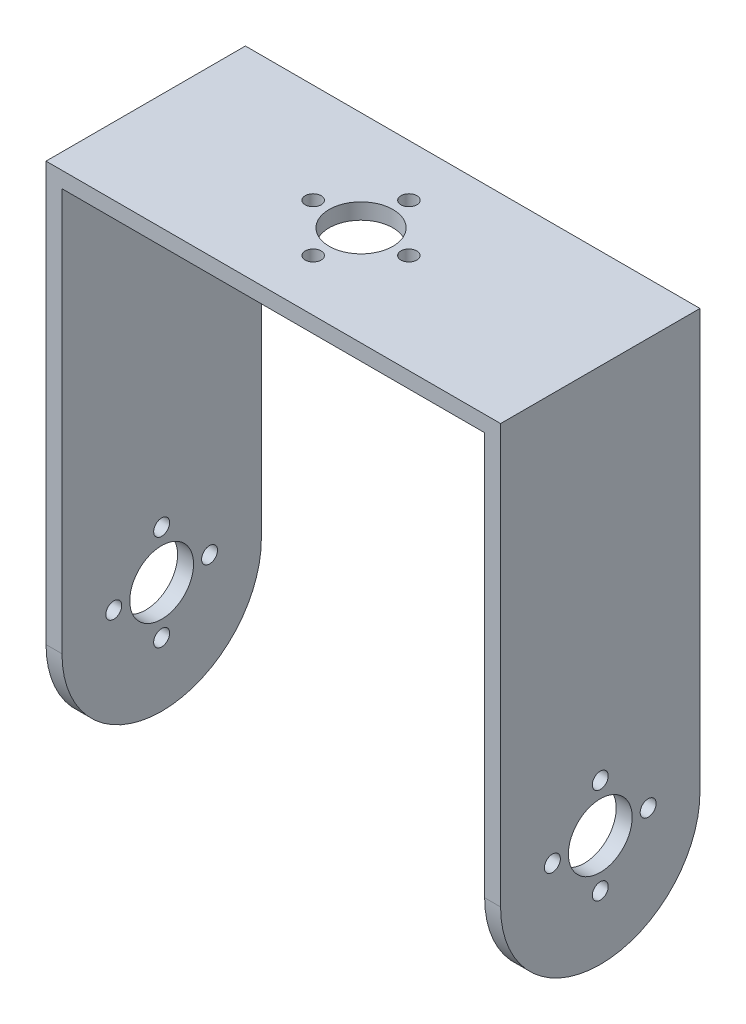
ISO-10303-21;
HEADER;
FILE_DESCRIPTION(('STEP AP214'),'2;1');
FILE_NAME('part.step','',(''),(''),'','','');
FILE_SCHEMA(('AUTOMOTIVE_DESIGN { 1 0 10303 214 1 1 1 1 }'));
ENDSEC;
DATA;
#1=APPLICATION_CONTEXT('core data for automotive mechanical design processes');
#2=APPLICATION_PROTOCOL_DEFINITION('international standard','automotive_design',2000,#1);
#3=PRODUCT_CONTEXT('',#1,'mechanical');
#4=PRODUCT('Part','Part','',(#3));
#5=PRODUCT_RELATED_PRODUCT_CATEGORY('part','',(#4));
#6=PRODUCT_DEFINITION_FORMATION('','',#4);
#7=PRODUCT_DEFINITION_CONTEXT('part definition',#1,'design');
#8=PRODUCT_DEFINITION('design','',#6,#7);
#9=PRODUCT_DEFINITION_SHAPE('','',#8);
#10=(LENGTH_UNIT() NAMED_UNIT(*) SI_UNIT(.MILLI.,.METRE.));
#11=(NAMED_UNIT(*) PLANE_ANGLE_UNIT() SI_UNIT($,.RADIAN.));
#12=(NAMED_UNIT(*) SI_UNIT($,.STERADIAN.) SOLID_ANGLE_UNIT());
#13=UNCERTAINTY_MEASURE_WITH_UNIT(LENGTH_MEASURE(1.E-05),#10,'distance_accuracy_value','');
#14=(GEOMETRIC_REPRESENTATION_CONTEXT(3) GLOBAL_UNCERTAINTY_ASSIGNED_CONTEXT((#13)) GLOBAL_UNIT_ASSIGNED_CONTEXT((#10,
#11,#12)) REPRESENTATION_CONTEXT('',''));
#15=CARTESIAN_POINT('',(0.,0.,0.));
#16=DIRECTION('',(0.,0.,1.));
#17=DIRECTION('',(1.,0.,0.));
#18=AXIS2_PLACEMENT_3D('',#15,#16,#17);
#19=CARTESIAN_POINT('',(-79.925523148209,43.3899538371544,25.));
#20=DIRECTION('',(-1.,0.,0.));
#21=DIRECTION('',(0.,0.,1.));
#22=AXIS2_PLACEMENT_3D('',#19,#20,#21);
#23=PLANE('',#22);
#24=CARTESIAN_POINT('',(-79.925523148209,0.391594966660007,12.4999999999999));
#25=DIRECTION('',(-1.,0.,0.));
#26=DIRECTION('',(0.,0.,1.));
#27=AXIS2_PLACEMENT_3D('',#24,#25,#26);
#28=CIRCLE('',#27,1.);
#29=CARTESIAN_POINT('',(-79.925523148209,0.391594966660007,13.4999999999999));
#30=VERTEX_POINT('',#29);
#31=EDGE_CURVE('E218',#30,#30,#28,.T.);
#32=ORIENTED_EDGE('',*,*,#31,.T.);
#33=EDGE_LOOP('',(#32));
#34=FACE_BOUND('',#33,.T.);
#35=CARTESIAN_POINT('',(-79.925523148209,-5.61349741649553,18.5050923831556));
#36=DIRECTION('',(-1.,0.,0.));
#37=DIRECTION('',(0.,0.,1.));
#38=AXIS2_PLACEMENT_3D('',#35,#36,#37);
#39=CIRCLE('',#38,1.);
#40=CARTESIAN_POINT('',(-79.925523148209,-5.61349741649553,19.5050923831556));
#41=VERTEX_POINT('',#40);
#42=EDGE_CURVE('E222',#41,#41,#39,.T.);
#43=ORIENTED_EDGE('',*,*,#42,.T.);
#44=EDGE_LOOP('',(#43));
#45=FACE_BOUND('',#44,.T.);
#46=CARTESIAN_POINT('',(-79.925523148209,-5.61349741649558,6.49490761684442));
#47=DIRECTION('',(-1.,0.,0.));
#48=DIRECTION('',(0.,0.,1.));
#49=AXIS2_PLACEMENT_3D('',#46,#47,#48);
#50=CIRCLE('',#49,1.);
#51=CARTESIAN_POINT('',(-79.925523148209,-5.61349741649558,7.49490761684442));
#52=VERTEX_POINT('',#51);
#53=EDGE_CURVE('E226',#52,#52,#50,.T.);
#54=ORIENTED_EDGE('',*,*,#53,.T.);
#55=EDGE_LOOP('',(#54));
#56=FACE_BOUND('',#55,.T.);
#57=CARTESIAN_POINT('',(-79.925523148209,-11.6185897996512,12.5));
#58=DIRECTION('',(-1.,0.,0.));
#59=DIRECTION('',(0.,0.,1.));
#60=AXIS2_PLACEMENT_3D('',#57,#58,#59);
#61=CIRCLE('',#60,1.);
#62=CARTESIAN_POINT('',(-79.925523148209,-11.6185897996512,13.5));
#63=VERTEX_POINT('',#62);
#64=EDGE_CURVE('E230',#63,#63,#61,.T.);
#65=ORIENTED_EDGE('',*,*,#64,.T.);
#66=EDGE_LOOP('',(#65));
#67=FACE_BOUND('',#66,.T.);
#68=CARTESIAN_POINT('',(-79.925523148209,-5.61349741649557,12.5));
#69=DIRECTION('',(-1.,0.,0.));
#70=DIRECTION('',(0.,0.,1.));
#71=AXIS2_PLACEMENT_3D('',#68,#69,#70);
#72=CIRCLE('',#71,4.);
#73=CARTESIAN_POINT('',(-79.925523148209,-5.61349741649557,16.5));
#74=VERTEX_POINT('',#73);
#75=EDGE_CURVE('E168',#74,#74,#72,.T.);
#76=ORIENTED_EDGE('',*,*,#75,.T.);
#77=EDGE_LOOP('',(#76));
#78=FACE_BOUND('',#77,.T.);
#79=DIRECTION('',(0.,1.,0.));
#80=VECTOR('',#79,1.);
#81=CARTESIAN_POINT('',(-79.925523148209,43.3899538371544,25.));
#82=LINE('',#81,#80);
#83=CARTESIAN_POINT('',(-79.925523148209,-7.11349741649558,25.));
#84=VERTEX_POINT('',#83);
#85=CARTESIAN_POINT('',(-79.925523148209,43.3899538371544,25.));
#86=VERTEX_POINT('',#85);
#87=EDGE_CURVE('E137',#84,#86,#82,.T.);
#88=ORIENTED_EDGE('',*,*,#87,.F.);
#89=CARTESIAN_POINT('',(-79.925523148209,-7.11349741649558,12.5));
#90=DIRECTION('',(-1.,0.,0.));
#91=DIRECTION('',(0.,0.,1.));
#92=AXIS2_PLACEMENT_3D('',#89,#90,#91);
#93=CIRCLE('',#92,12.5);
#94=CARTESIAN_POINT('',(-79.925523148209,-7.11349741649558,0.));
#95=VERTEX_POINT('',#94);
#96=EDGE_CURVE('E109',#95,#84,#93,.T.);
#97=ORIENTED_EDGE('',*,*,#96,.F.);
#98=DIRECTION('',(0.,1.,0.));
#99=VECTOR('',#98,1.);
#100=CARTESIAN_POINT('',(-79.925523148209,43.3899538371544,0.));
#101=LINE('',#100,#99);
#102=CARTESIAN_POINT('',(-79.925523148209,43.3899538371544,0.));
#103=VERTEX_POINT('',#102);
#104=EDGE_CURVE('E125',#95,#103,#101,.T.);
#105=ORIENTED_EDGE('',*,*,#104,.T.);
#106=DIRECTION('',(0.,0.,-1.));
#107=VECTOR('',#106,1.);
#108=CARTESIAN_POINT('',(-79.925523148209,43.3899538371544,25.));
#109=LINE('',#108,#107);
#110=EDGE_CURVE('E144',#86,#103,#109,.T.);
#111=ORIENTED_EDGE('',*,*,#110,.F.);
#112=EDGE_LOOP('',(#88,#97,#105,#111));
#113=FACE_BOUND('',#112,.T.);
#114=ADVANCED_FACE('F34',(#34,#45,#56,#67,#78,#113),#23,.F.);
#115=CARTESIAN_POINT('',(-26.925523148209,43.3899538371544,25.));
#116=DIRECTION('',(1.,0.,0.));
#117=DIRECTION('',(0.,1.,0.));
#118=AXIS2_PLACEMENT_3D('',#115,#116,#117);
#119=PLANE('',#118);
#120=CARTESIAN_POINT('',(-26.925523148209,0.391594966660024,12.4999999999999));
#121=DIRECTION('',(1.,0.,0.));
#122=DIRECTION('',(0.,1.,0.));
#123=AXIS2_PLACEMENT_3D('',#120,#121,#122);
#124=CIRCLE('',#123,1.);
#125=CARTESIAN_POINT('',(-26.925523148209,1.39159496666002,12.4999999999999));
#126=VERTEX_POINT('',#125);
#127=EDGE_CURVE('E425',#126,#126,#124,.T.);
#128=ORIENTED_EDGE('',*,*,#127,.T.);
#129=EDGE_LOOP('',(#128));
#130=FACE_BOUND('',#129,.T.);
#131=CARTESIAN_POINT('',(-26.925523148209,-5.61349741649552,18.5050923831556));
#132=DIRECTION('',(1.,0.,0.));
#133=DIRECTION('',(0.,1.,0.));
#134=AXIS2_PLACEMENT_3D('',#131,#132,#133);
#135=CIRCLE('',#134,1.);
#136=CARTESIAN_POINT('',(-26.925523148209,-4.61349741649552,18.5050923831556));
#137=VERTEX_POINT('',#136);
#138=EDGE_CURVE('E417',#137,#137,#135,.T.);
#139=ORIENTED_EDGE('',*,*,#138,.T.);
#140=EDGE_LOOP('',(#139));
#141=FACE_BOUND('',#140,.T.);
#142=CARTESIAN_POINT('',(-26.925523148209,-5.61349741649556,6.49490761684442));
#143=DIRECTION('',(1.,0.,0.));
#144=DIRECTION('',(0.,1.,0.));
#145=AXIS2_PLACEMENT_3D('',#142,#143,#144);
#146=CIRCLE('',#145,1.);
#147=CARTESIAN_POINT('',(-26.925523148209,-4.61349741649556,6.49490761684442));
#148=VERTEX_POINT('',#147);
#149=EDGE_CURVE('E283',#148,#148,#146,.T.);
#150=ORIENTED_EDGE('',*,*,#149,.T.);
#151=EDGE_LOOP('',(#150));
#152=FACE_BOUND('',#151,.T.);
#153=CARTESIAN_POINT('',(-26.925523148209,-11.6185897996511,12.5));
#154=DIRECTION('',(1.,0.,0.));
#155=DIRECTION('',(0.,1.,0.));
#156=AXIS2_PLACEMENT_3D('',#153,#154,#155);
#157=CIRCLE('',#156,1.);
#158=CARTESIAN_POINT('',(-26.925523148209,-10.6185897996511,12.5));
#159=VERTEX_POINT('',#158);
#160=EDGE_CURVE('E281',#159,#159,#157,.T.);
#161=ORIENTED_EDGE('',*,*,#160,.T.);
#162=EDGE_LOOP('',(#161));
#163=FACE_BOUND('',#162,.T.);
#164=CARTESIAN_POINT('',(-26.925523148209,-5.61349741649556,12.5));
#165=DIRECTION('',(1.,0.,0.));
#166=DIRECTION('',(0.,1.,0.));
#167=AXIS2_PLACEMENT_3D('',#164,#165,#166);
#168=CIRCLE('',#167,4.);
#169=CARTESIAN_POINT('',(-26.925523148209,-1.61349741649556,12.5));
#170=VERTEX_POINT('',#169);
#171=EDGE_CURVE('E164',#170,#170,#168,.T.);
#172=ORIENTED_EDGE('',*,*,#171,.T.);
#173=EDGE_LOOP('',(#172));
#174=FACE_BOUND('',#173,.T.);
#175=CARTESIAN_POINT('',(-26.925523148209,-7.11349741649557,12.5));
#176=DIRECTION('',(1.,0.,0.));
#177=DIRECTION('',(0.,1.,0.));
#178=AXIS2_PLACEMENT_3D('',#175,#176,#177);
#179=CIRCLE('',#178,12.5);
#180=CARTESIAN_POINT('',(-26.925523148209,-7.11349741649557,25.));
#181=VERTEX_POINT('',#180);
#182=CARTESIAN_POINT('',(-26.925523148209,-7.11349741649558,0.));
#183=VERTEX_POINT('',#182);
#184=EDGE_CURVE('E48',#181,#183,#179,.T.);
#185=ORIENTED_EDGE('',*,*,#184,.F.);
#186=DIRECTION('',(0.,-1.,0.));
#187=VECTOR('',#186,1.);
#188=CARTESIAN_POINT('',(-26.925523148209,43.3899538371544,25.));
#189=LINE('',#188,#187);
#190=CARTESIAN_POINT('',(-26.925523148209,43.3899538371544,25.));
#191=VERTEX_POINT('',#190);
#192=EDGE_CURVE('E179',#191,#181,#189,.T.);
#193=ORIENTED_EDGE('',*,*,#192,.F.);
#194=DIRECTION('',(0.,0.,-1.));
#195=VECTOR('',#194,1.);
#196=CARTESIAN_POINT('',(-26.925523148209,43.3899538371544,25.));
#197=LINE('',#196,#195);
#198=CARTESIAN_POINT('',(-26.925523148209,43.3899538371544,0.));
#199=VERTEX_POINT('',#198);
#200=EDGE_CURVE('E141',#191,#199,#197,.T.);
#201=ORIENTED_EDGE('',*,*,#200,.T.);
#202=DIRECTION('',(0.,-1.,0.));
#203=VECTOR('',#202,1.);
#204=CARTESIAN_POINT('',(-26.925523148209,43.3899538371544,0.));
#205=LINE('',#204,#203);
#206=EDGE_CURVE('E130',#199,#183,#205,.T.);
#207=ORIENTED_EDGE('',*,*,#206,.T.);
#208=EDGE_LOOP('',(#185,#193,#201,#207));
#209=FACE_BOUND('',#208,.T.);
#210=ADVANCED_FACE('F190',(#130,#141,#152,#163,#174,#209),#119,.F.);
#211=CARTESIAN_POINT('',(-24.925523148209,45.3865025835044,25.));
#212=DIRECTION('',(-1.,0.,0.));
#213=DIRECTION('',(0.,-1.,0.));
#214=AXIS2_PLACEMENT_3D('',#211,#212,#213);
#215=PLANE('',#214);
#216=CARTESIAN_POINT('',(-24.925523148209,0.391594966660025,12.4999999999999));
#217=DIRECTION('',(1.,0.,0.));
#218=DIRECTION('',(0.,1.,0.));
#219=AXIS2_PLACEMENT_3D('',#216,#217,#218);
#220=CIRCLE('',#219,1.);
#221=CARTESIAN_POINT('',(-24.925523148209,1.39159496666002,12.4999999999999));
#222=VERTEX_POINT('',#221);
#223=EDGE_CURVE('E260',#222,#222,#220,.T.);
#224=ORIENTED_EDGE('',*,*,#223,.F.);
#225=EDGE_LOOP('',(#224));
#226=FACE_BOUND('',#225,.T.);
#227=CARTESIAN_POINT('',(-24.925523148209,-5.61349741649552,18.5050923831556));
#228=DIRECTION('',(1.,0.,0.));
#229=DIRECTION('',(0.,1.,0.));
#230=AXIS2_PLACEMENT_3D('',#227,#228,#229);
#231=CIRCLE('',#230,1.);
#232=CARTESIAN_POINT('',(-24.925523148209,-4.61349741649552,18.5050923831556));
#233=VERTEX_POINT('',#232);
#234=EDGE_CURVE('E264',#233,#233,#231,.T.);
#235=ORIENTED_EDGE('',*,*,#234,.F.);
#236=EDGE_LOOP('',(#235));
#237=FACE_BOUND('',#236,.T.);
#238=CARTESIAN_POINT('',(-24.925523148209,-5.61349741649556,6.49490761684442));
#239=DIRECTION('',(1.,0.,0.));
#240=DIRECTION('',(0.,1.,0.));
#241=AXIS2_PLACEMENT_3D('',#238,#239,#240);
#242=CIRCLE('',#241,1.);
#243=CARTESIAN_POINT('',(-24.925523148209,-4.61349741649556,6.49490761684442));
#244=VERTEX_POINT('',#243);
#245=EDGE_CURVE('E268',#244,#244,#242,.T.);
#246=ORIENTED_EDGE('',*,*,#245,.F.);
#247=EDGE_LOOP('',(#246));
#248=FACE_BOUND('',#247,.T.);
#249=CARTESIAN_POINT('',(-24.925523148209,-11.6185897996511,12.5));
#250=DIRECTION('',(1.,0.,0.));
#251=DIRECTION('',(0.,1.,0.));
#252=AXIS2_PLACEMENT_3D('',#249,#250,#251);
#253=CIRCLE('',#252,1.);
#254=CARTESIAN_POINT('',(-24.925523148209,-10.6185897996511,12.5));
#255=VERTEX_POINT('',#254);
#256=EDGE_CURVE('E272',#255,#255,#253,.T.);
#257=ORIENTED_EDGE('',*,*,#256,.F.);
#258=EDGE_LOOP('',(#257));
#259=FACE_BOUND('',#258,.T.);
#260=CARTESIAN_POINT('',(-24.9255231482089,-5.61349741649556,12.5));
#261=DIRECTION('',(-1.,0.,0.));
#262=DIRECTION('',(0.,-1.,0.));
#263=AXIS2_PLACEMENT_3D('',#260,#261,#262);
#264=CIRCLE('',#263,4.);
#265=CARTESIAN_POINT('',(-24.9255231482089,-9.61349741649556,12.5));
#266=VERTEX_POINT('',#265);
#267=EDGE_CURVE('E157',#266,#266,#264,.T.);
#268=ORIENTED_EDGE('',*,*,#267,.T.);
#269=EDGE_LOOP('',(#268));
#270=FACE_BOUND('',#269,.T.);
#271=DIRECTION('',(0.,1.,0.));
#272=VECTOR('',#271,1.);
#273=CARTESIAN_POINT('',(-24.925523148209,45.3865025835044,25.));
#274=LINE('',#273,#272);
#275=CARTESIAN_POINT('',(-24.9255231482089,-7.11349741649557,25.));
#276=VERTEX_POINT('',#275);
#277=CARTESIAN_POINT('',(-24.925523148209,45.3865025835044,25.));
#278=VERTEX_POINT('',#277);
#279=EDGE_CURVE('E121',#276,#278,#274,.T.);
#280=ORIENTED_EDGE('',*,*,#279,.F.);
#281=CARTESIAN_POINT('',(-24.9255231482089,-7.11349741649557,12.5));
#282=DIRECTION('',(-1.,0.,0.));
#283=DIRECTION('',(0.,-1.,0.));
#284=AXIS2_PLACEMENT_3D('',#281,#282,#283);
#285=CIRCLE('',#284,12.5);
#286=CARTESIAN_POINT('',(-24.9255231482089,-7.11349741649557,0.));
#287=VERTEX_POINT('',#286);
#288=EDGE_CURVE('E103',#287,#276,#285,.T.);
#289=ORIENTED_EDGE('',*,*,#288,.F.);
#290=DIRECTION('',(0.,1.,0.));
#291=VECTOR('',#290,1.);
#292=CARTESIAN_POINT('',(-24.925523148209,45.3865025835044,0.));
#293=LINE('',#292,#291);
#294=CARTESIAN_POINT('',(-24.925523148209,45.3865025835044,0.));
#295=VERTEX_POINT('',#294);
#296=EDGE_CURVE('E133',#287,#295,#293,.T.);
#297=ORIENTED_EDGE('',*,*,#296,.T.);
#298=DIRECTION('',(0.,0.,-1.));
#299=VECTOR('',#298,1.);
#300=CARTESIAN_POINT('',(-24.925523148209,45.3865025835044,25.));
#301=LINE('',#300,#299);
#302=EDGE_CURVE('E119',#278,#295,#301,.T.);
#303=ORIENTED_EDGE('',*,*,#302,.F.);
#304=EDGE_LOOP('',(#280,#289,#297,#303));
#305=FACE_BOUND('',#304,.T.);
#306=ADVANCED_FACE('F185',(#226,#237,#248,#259,#270,#305),#215,.F.);
#307=CARTESIAN_POINT('',(-81.925523148209,45.3865025835044,25.));
#308=DIRECTION('',(1.,0.,0.));
#309=DIRECTION('',(0.,1.,0.));
#310=AXIS2_PLACEMENT_3D('',#307,#308,#309);
#311=PLANE('',#310);
#312=CARTESIAN_POINT('',(-81.925523148209,0.391594966660006,12.4999999999999));
#313=DIRECTION('',(1.,0.,0.));
#314=DIRECTION('',(0.,1.,0.));
#315=AXIS2_PLACEMENT_3D('',#312,#313,#314);
#316=CIRCLE('',#315,1.);
#317=CARTESIAN_POINT('',(-81.925523148209,1.39159496666001,12.4999999999999));
#318=VERTEX_POINT('',#317);
#319=EDGE_CURVE('E428',#318,#318,#316,.T.);
#320=ORIENTED_EDGE('',*,*,#319,.T.);
#321=EDGE_LOOP('',(#320));
#322=FACE_BOUND('',#321,.T.);
#323=CARTESIAN_POINT('',(-81.925523148209,-5.61349741649553,18.5050923831556));
#324=DIRECTION('',(1.,0.,0.));
#325=DIRECTION('',(0.,1.,0.));
#326=AXIS2_PLACEMENT_3D('',#323,#324,#325);
#327=CIRCLE('',#326,1.);
#328=CARTESIAN_POINT('',(-81.925523148209,-4.61349741649553,18.5050923831556));
#329=VERTEX_POINT('',#328);
#330=EDGE_CURVE('E420',#329,#329,#327,.T.);
#331=ORIENTED_EDGE('',*,*,#330,.T.);
#332=EDGE_LOOP('',(#331));
#333=FACE_BOUND('',#332,.T.);
#334=CARTESIAN_POINT('',(-81.925523148209,-5.61349741649558,6.49490761684442));
#335=DIRECTION('',(1.,0.,0.));
#336=DIRECTION('',(0.,1.,0.));
#337=AXIS2_PLACEMENT_3D('',#334,#335,#336);
#338=CIRCLE('',#337,1.);
#339=CARTESIAN_POINT('',(-81.925523148209,-4.61349741649558,6.49490761684442));
#340=VERTEX_POINT('',#339);
#341=EDGE_CURVE('E409',#340,#340,#338,.T.);
#342=ORIENTED_EDGE('',*,*,#341,.T.);
#343=EDGE_LOOP('',(#342));
#344=FACE_BOUND('',#343,.T.);
#345=CARTESIAN_POINT('',(-81.925523148209,-11.6185897996512,12.5));
#346=DIRECTION('',(1.,0.,0.));
#347=DIRECTION('',(0.,1.,0.));
#348=AXIS2_PLACEMENT_3D('',#345,#346,#347);
#349=CIRCLE('',#348,1.);
#350=CARTESIAN_POINT('',(-81.925523148209,-10.6185897996512,12.5));
#351=VERTEX_POINT('',#350);
#352=EDGE_CURVE('E278',#351,#351,#349,.T.);
#353=ORIENTED_EDGE('',*,*,#352,.T.);
#354=EDGE_LOOP('',(#353));
#355=FACE_BOUND('',#354,.T.);
#356=CARTESIAN_POINT('',(-81.925523148209,-5.61349741649557,12.5));
#357=DIRECTION('',(-1.,0.,0.));
#358=DIRECTION('',(0.,-1.,0.));
#359=AXIS2_PLACEMENT_3D('',#356,#357,#358);
#360=CIRCLE('',#359,4.);
#361=CARTESIAN_POINT('',(-81.925523148209,-9.61349741649557,12.5));
#362=VERTEX_POINT('',#361);
#363=EDGE_CURVE('E154',#362,#362,#360,.T.);
#364=ORIENTED_EDGE('',*,*,#363,.F.);
#365=EDGE_LOOP('',(#364));
#366=FACE_BOUND('',#365,.T.);
#367=CARTESIAN_POINT('',(-81.925523148209,-7.11349741649558,12.5));
#368=DIRECTION('',(-1.,0.,0.));
#369=DIRECTION('',(0.,-1.,0.));
#370=AXIS2_PLACEMENT_3D('',#367,#368,#369);
#371=CIRCLE('',#370,12.5);
#372=CARTESIAN_POINT('',(-81.925523148209,-7.11349741649558,0.));
#373=VERTEX_POINT('',#372);
#374=CARTESIAN_POINT('',(-81.925523148209,-7.11349741649558,25.));
#375=VERTEX_POINT('',#374);
#376=EDGE_CURVE('E55',#373,#375,#371,.T.);
#377=ORIENTED_EDGE('',*,*,#376,.T.);
#378=DIRECTION('',(0.,-1.,0.));
#379=VECTOR('',#378,1.);
#380=CARTESIAN_POINT('',(-81.925523148209,45.3865025835044,25.));
#381=LINE('',#380,#379);
#382=CARTESIAN_POINT('',(-81.925523148209,45.3865025835044,25.));
#383=VERTEX_POINT('',#382);
#384=EDGE_CURVE('E100',#383,#375,#381,.T.);
#385=ORIENTED_EDGE('',*,*,#384,.F.);
#386=DIRECTION('',(0.,0.,-1.));
#387=VECTOR('',#386,1.);
#388=CARTESIAN_POINT('',(-81.925523148209,45.3865025835044,25.));
#389=LINE('',#388,#387);
#390=CARTESIAN_POINT('',(-81.925523148209,45.3865025835044,0.));
#391=VERTEX_POINT('',#390);
#392=EDGE_CURVE('E117',#383,#391,#389,.T.);
#393=ORIENTED_EDGE('',*,*,#392,.T.);
#394=DIRECTION('',(0.,-1.,0.));
#395=VECTOR('',#394,1.);
#396=CARTESIAN_POINT('',(-81.925523148209,45.3865025835044,0.));
#397=LINE('',#396,#395);
#398=EDGE_CURVE('E102',#391,#373,#397,.T.);
#399=ORIENTED_EDGE('',*,*,#398,.T.);
#400=EDGE_LOOP('',(#377,#385,#393,#399));
#401=FACE_BOUND('',#400,.T.);
#402=ADVANCED_FACE('F97',(#322,#333,#344,#355,#366,#401),#311,.F.);
#403=CARTESIAN_POINT('',(-79.925523148209,43.3899538371544,25.));
#404=DIRECTION('',(0.,1.,0.));
#405=DIRECTION('',(0.,0.,1.));
#406=AXIS2_PLACEMENT_3D('',#403,#404,#405);
#407=PLANE('',#406);
#408=CARTESIAN_POINT('',(-60.9255242227313,43.3899538371544,12.4999988656517));
#409=DIRECTION('',(0.,1.,0.));
#410=DIRECTION('',(0.,0.,1.));
#411=AXIS2_PLACEMENT_3D('',#408,#409,#410);
#412=CIRCLE('',#411,1.);
#413=CARTESIAN_POINT('',(-60.9255242227313,43.3899538371544,13.4999988656517));
#414=VERTEX_POINT('',#413);
#415=EDGE_CURVE('E450',#414,#414,#412,.T.);
#416=ORIENTED_EDGE('',*,*,#415,.T.);
#417=EDGE_LOOP('',(#416));
#418=FACE_BOUND('',#417,.T.);
#419=CARTESIAN_POINT('',(-54.9255242227312,43.3899538371544,18.4999988656516));
#420=DIRECTION('',(0.,1.,0.));
#421=DIRECTION('',(0.,0.,1.));
#422=AXIS2_PLACEMENT_3D('',#419,#420,#421);
#423=CIRCLE('',#422,1.);
#424=CARTESIAN_POINT('',(-54.9255242227312,43.3899538371544,19.4999988656517));
#425=VERTEX_POINT('',#424);
#426=EDGE_CURVE('E444',#425,#425,#423,.T.);
#427=ORIENTED_EDGE('',*,*,#426,.T.);
#428=EDGE_LOOP('',(#427));
#429=FACE_BOUND('',#428,.T.);
#430=CARTESIAN_POINT('',(-48.9255242227313,43.3899538371544,12.4999988656516));
#431=DIRECTION('',(0.,1.,0.));
#432=DIRECTION('',(0.,0.,1.));
#433=AXIS2_PLACEMENT_3D('',#430,#431,#432);
#434=CIRCLE('',#433,0.999999999999996);
#435=CARTESIAN_POINT('',(-48.9255242227313,43.3899538371544,13.4999988656516));
#436=VERTEX_POINT('',#435);
#437=EDGE_CURVE('E438',#436,#436,#434,.T.);
#438=ORIENTED_EDGE('',*,*,#437,.T.);
#439=EDGE_LOOP('',(#438));
#440=FACE_BOUND('',#439,.T.);
#441=CARTESIAN_POINT('',(-54.9255242227314,43.3899538371544,6.49999886565165));
#442=DIRECTION('',(0.,1.,0.));
#443=DIRECTION('',(0.,0.,1.));
#444=AXIS2_PLACEMENT_3D('',#441,#442,#443);
#445=CIRCLE('',#444,0.999999999999998);
#446=CARTESIAN_POINT('',(-54.9255242227314,43.3899538371544,7.49999886565164));
#447=VERTEX_POINT('',#446);
#448=EDGE_CURVE('E430',#447,#447,#445,.T.);
#449=ORIENTED_EDGE('',*,*,#448,.T.);
#450=EDGE_LOOP('',(#449));
#451=FACE_BOUND('',#450,.T.);
#452=CARTESIAN_POINT('',(-54.925523148209,43.3899538371544,12.5));
#453=DIRECTION('',(0.,1.,0.));
#454=DIRECTION('',(0.,0.,1.));
#455=AXIS2_PLACEMENT_3D('',#452,#453,#454);
#456=CIRCLE('',#455,4.00000000000001);
#457=CARTESIAN_POINT('',(-54.925523148209,43.3899538371544,16.5));
#458=VERTEX_POINT('',#457);
#459=EDGE_CURVE('E128',#458,#458,#456,.T.);
#460=ORIENTED_EDGE('',*,*,#459,.T.);
#461=EDGE_LOOP('',(#460));
#462=FACE_BOUND('',#461,.T.);
#463=DIRECTION('',(1.,0.,0.));
#464=VECTOR('',#463,1.);
#465=CARTESIAN_POINT('',(-79.925523148209,43.3899538371544,0.));
#466=LINE('',#465,#464);
#467=EDGE_CURVE('E127',#103,#199,#466,.T.);
#468=ORIENTED_EDGE('',*,*,#467,.T.);
#469=ORIENTED_EDGE('',*,*,#200,.F.);
#470=DIRECTION('',(1.,0.,0.));
#471=VECTOR('',#470,1.);
#472=CARTESIAN_POINT('',(-79.925523148209,43.3899538371544,25.));
#473=LINE('',#472,#471);
#474=EDGE_CURVE('E177',#86,#191,#473,.T.);
#475=ORIENTED_EDGE('',*,*,#474,.F.);
#476=ORIENTED_EDGE('',*,*,#110,.T.);
#477=EDGE_LOOP('',(#468,#469,#475,#476));
#478=FACE_BOUND('',#477,.T.);
#479=ADVANCED_FACE('F195',(#418,#429,#440,#451,#462,#478),#407,.F.);
#480=CARTESIAN_POINT('',(-81.925523148209,45.3865025835044,25.));
#481=DIRECTION('',(0.,-1.,0.));
#482=DIRECTION('',(0.,0.,-1.));
#483=AXIS2_PLACEMENT_3D('',#480,#481,#482);
#484=PLANE('',#483);
#485=CARTESIAN_POINT('',(-60.9255242227313,45.3865025835044,12.4999988656517));
#486=DIRECTION('',(0.,1.,0.));
#487=DIRECTION('',(0.,0.,1.));
#488=AXIS2_PLACEMENT_3D('',#485,#486,#487);
#489=CIRCLE('',#488,1.);
#490=CARTESIAN_POINT('',(-60.9255242227313,45.3865025835044,13.4999988656517));
#491=VERTEX_POINT('',#490);
#492=EDGE_CURVE('E452',#491,#491,#489,.T.);
#493=ORIENTED_EDGE('',*,*,#492,.F.);
#494=EDGE_LOOP('',(#493));
#495=FACE_BOUND('',#494,.T.);
#496=CARTESIAN_POINT('',(-54.9255242227312,45.3865025835044,18.4999988656516));
#497=DIRECTION('',(0.,1.,0.));
#498=DIRECTION('',(0.,0.,1.));
#499=AXIS2_PLACEMENT_3D('',#496,#497,#498);
#500=CIRCLE('',#499,1.);
#501=CARTESIAN_POINT('',(-54.9255242227312,45.3865025835044,19.4999988656517));
#502=VERTEX_POINT('',#501);
#503=EDGE_CURVE('E447',#502,#502,#500,.T.);
#504=ORIENTED_EDGE('',*,*,#503,.F.);
#505=EDGE_LOOP('',(#504));
#506=FACE_BOUND('',#505,.T.);
#507=CARTESIAN_POINT('',(-48.9255242227313,45.3865025835044,12.4999988656516));
#508=DIRECTION('',(0.,1.,0.));
#509=DIRECTION('',(0.,0.,1.));
#510=AXIS2_PLACEMENT_3D('',#507,#508,#509);
#511=CIRCLE('',#510,0.999999999999996);
#512=CARTESIAN_POINT('',(-48.9255242227313,45.3865025835044,13.4999988656516));
#513=VERTEX_POINT('',#512);
#514=EDGE_CURVE('E441',#513,#513,#511,.T.);
#515=ORIENTED_EDGE('',*,*,#514,.F.);
#516=EDGE_LOOP('',(#515));
#517=FACE_BOUND('',#516,.T.);
#518=CARTESIAN_POINT('',(-54.9255242227314,45.3865025835044,6.49999886565165));
#519=DIRECTION('',(0.,1.,0.));
#520=DIRECTION('',(0.,0.,1.));
#521=AXIS2_PLACEMENT_3D('',#518,#519,#520);
#522=CIRCLE('',#521,0.999999999999998);
#523=CARTESIAN_POINT('',(-54.9255242227314,45.3865025835044,7.49999886565164));
#524=VERTEX_POINT('',#523);
#525=EDGE_CURVE('E435',#524,#524,#522,.T.);
#526=ORIENTED_EDGE('',*,*,#525,.F.);
#527=EDGE_LOOP('',(#526));
#528=FACE_BOUND('',#527,.T.);
#529=CARTESIAN_POINT('',(-54.925523148209,45.3865025835044,12.5));
#530=DIRECTION('',(0.,1.,0.));
#531=DIRECTION('',(0.,0.,1.));
#532=AXIS2_PLACEMENT_3D('',#529,#530,#531);
#533=CIRCLE('',#532,4.00000000000001);
#534=CARTESIAN_POINT('',(-54.925523148209,45.3865025835044,16.5));
#535=VERTEX_POINT('',#534);
#536=EDGE_CURVE('E171',#535,#535,#533,.T.);
#537=ORIENTED_EDGE('',*,*,#536,.F.);
#538=EDGE_LOOP('',(#537));
#539=FACE_BOUND('',#538,.T.);
#540=DIRECTION('',(-1.,0.,0.));
#541=VECTOR('',#540,1.);
#542=CARTESIAN_POINT('',(-81.925523148209,45.3865025835044,0.));
#543=LINE('',#542,#541);
#544=EDGE_CURVE('E135',#295,#391,#543,.T.);
#545=ORIENTED_EDGE('',*,*,#544,.T.);
#546=ORIENTED_EDGE('',*,*,#392,.F.);
#547=DIRECTION('',(-1.,0.,0.));
#548=VECTOR('',#547,1.);
#549=CARTESIAN_POINT('',(-27.0429671921119,45.3865025835044,25.));
#550=LINE('',#549,#548);
#551=EDGE_CURVE('E115',#278,#383,#550,.T.);
#552=ORIENTED_EDGE('',*,*,#551,.F.);
#553=ORIENTED_EDGE('',*,*,#302,.T.);
#554=EDGE_LOOP('',(#545,#546,#552,#553));
#555=FACE_BOUND('',#554,.T.);
#556=ADVANCED_FACE('F187',(#495,#506,#517,#528,#539,#555),#484,.F.);
#557=CARTESIAN_POINT('',(0.,0.,25.));
#558=DIRECTION('',(0.,0.,1.));
#559=DIRECTION('',(1.,0.,0.));
#560=AXIS2_PLACEMENT_3D('',#557,#558,#559);
#561=PLANE('',#560);
#562=DIRECTION('',(-1.,0.,0.));
#563=VECTOR('',#562,1.);
#564=CARTESIAN_POINT('',(-24.9255231482089,-7.11349741649557,25.));
#565=LINE('',#564,#563);
#566=EDGE_CURVE('E104',#276,#181,#565,.T.);
#567=ORIENTED_EDGE('',*,*,#566,.F.);
#568=ORIENTED_EDGE('',*,*,#279,.T.);
#569=ORIENTED_EDGE('',*,*,#551,.T.);
#570=ORIENTED_EDGE('',*,*,#384,.T.);
#571=DIRECTION('',(-1.,0.,0.));
#572=VECTOR('',#571,1.);
#573=CARTESIAN_POINT('',(-24.9255231482089,-7.11349741649557,25.));
#574=LINE('',#573,#572);
#575=EDGE_CURVE('E11',#84,#375,#574,.T.);
#576=ORIENTED_EDGE('',*,*,#575,.F.);
#577=ORIENTED_EDGE('',*,*,#87,.T.);
#578=ORIENTED_EDGE('',*,*,#474,.T.);
#579=ORIENTED_EDGE('',*,*,#192,.T.);
#580=EDGE_LOOP('',(#567,#568,#569,#570,#576,#577,#578,#579));
#581=FACE_BOUND('',#580,.T.);
#582=ADVANCED_FACE('F113',(#581),#561,.T.);
#583=CARTESIAN_POINT('',(0.,0.,0.));
#584=DIRECTION('',(0.,0.,1.));
#585=DIRECTION('',(1.,0.,0.));
#586=AXIS2_PLACEMENT_3D('',#583,#584,#585);
#587=PLANE('',#586);
#588=ORIENTED_EDGE('',*,*,#296,.F.);
#589=DIRECTION('',(-1.,0.,0.));
#590=VECTOR('',#589,1.);
#591=CARTESIAN_POINT('',(-24.9255231482089,-7.11349741649557,0.));
#592=LINE('',#591,#590);
#593=EDGE_CURVE('E159',#287,#183,#592,.T.);
#594=ORIENTED_EDGE('',*,*,#593,.T.);
#595=ORIENTED_EDGE('',*,*,#206,.F.);
#596=ORIENTED_EDGE('',*,*,#467,.F.);
#597=ORIENTED_EDGE('',*,*,#104,.F.);
#598=DIRECTION('',(-1.,0.,0.));
#599=VECTOR('',#598,1.);
#600=CARTESIAN_POINT('',(-24.9255231482089,-7.11349741649557,0.));
#601=LINE('',#600,#599);
#602=EDGE_CURVE('E41',#95,#373,#601,.T.);
#603=ORIENTED_EDGE('',*,*,#602,.T.);
#604=ORIENTED_EDGE('',*,*,#398,.F.);
#605=ORIENTED_EDGE('',*,*,#544,.F.);
#606=EDGE_LOOP('',(#588,#594,#595,#596,#597,#603,#604,#605));
#607=FACE_BOUND('',#606,.T.);
#608=ADVANCED_FACE('F149',(#607),#587,.F.);
#609=CARTESIAN_POINT('',(-54.925523148209,-19.6134974164956,12.5));
#610=DIRECTION('',(0.,1.,0.));
#611=DIRECTION('',(0.,0.,1.));
#612=AXIS2_PLACEMENT_3D('',#609,#610,#611);
#613=CYLINDRICAL_SURFACE('',#612,4.00000000000001);
#614=ORIENTED_EDGE('',*,*,#536,.T.);
#615=EDGE_LOOP('',(#614));
#616=FACE_BOUND('',#615,.T.);
#617=ORIENTED_EDGE('',*,*,#459,.F.);
#618=EDGE_LOOP('',(#617));
#619=FACE_BOUND('',#618,.T.);
#620=ADVANCED_FACE('F236',(#616,#619),#613,.F.);
#621=CARTESIAN_POINT('',(-24.9255231482089,-5.61349741649556,12.5));
#622=DIRECTION('',(-1.,0.,0.));
#623=DIRECTION('',(0.,-1.,0.));
#624=AXIS2_PLACEMENT_3D('',#621,#622,#623);
#625=CYLINDRICAL_SURFACE('',#624,4.);
#626=ORIENTED_EDGE('',*,*,#363,.T.);
#627=EDGE_LOOP('',(#626));
#628=FACE_BOUND('',#627,.T.);
#629=ORIENTED_EDGE('',*,*,#75,.F.);
#630=EDGE_LOOP('',(#629));
#631=FACE_BOUND('',#630,.T.);
#632=ADVANCED_FACE('F233',(#628,#631),#625,.F.);
#633=ORIENTED_EDGE('',*,*,#267,.F.);
#634=EDGE_LOOP('',(#633));
#635=FACE_BOUND('',#634,.T.);
#636=ORIENTED_EDGE('',*,*,#171,.F.);
#637=EDGE_LOOP('',(#636));
#638=FACE_BOUND('',#637,.T.);
#639=ADVANCED_FACE('F235',(#635,#638),#625,.F.);
#640=CARTESIAN_POINT('',(-24.9255231482089,-7.11349741649557,12.5));
#641=DIRECTION('',(-1.,0.,0.));
#642=DIRECTION('',(0.,-1.,0.));
#643=AXIS2_PLACEMENT_3D('',#640,#641,#642);
#644=CYLINDRICAL_SURFACE('',#643,12.5);
#645=ORIENTED_EDGE('',*,*,#96,.T.);
#646=ORIENTED_EDGE('',*,*,#575,.T.);
#647=ORIENTED_EDGE('',*,*,#376,.F.);
#648=ORIENTED_EDGE('',*,*,#602,.F.);
#649=EDGE_LOOP('',(#645,#646,#647,#648));
#650=FACE_BOUND('',#649,.T.);
#651=ADVANCED_FACE('F107',(#650),#644,.T.);
#652=ORIENTED_EDGE('',*,*,#184,.T.);
#653=ORIENTED_EDGE('',*,*,#593,.F.);
#654=ORIENTED_EDGE('',*,*,#288,.T.);
#655=ORIENTED_EDGE('',*,*,#566,.T.);
#656=EDGE_LOOP('',(#652,#653,#654,#655));
#657=FACE_BOUND('',#656,.T.);
#658=ADVANCED_FACE('F290',(#657),#644,.T.);
#659=CARTESIAN_POINT('',(-81.925523148209,-11.6185897996512,12.5));
#660=DIRECTION('',(1.,0.,0.));
#661=DIRECTION('',(0.,1.,0.));
#662=AXIS2_PLACEMENT_3D('',#659,#660,#661);
#663=CYLINDRICAL_SURFACE('',#662,1.);
#664=ORIENTED_EDGE('',*,*,#352,.F.);
#665=EDGE_LOOP('',(#664));
#666=FACE_BOUND('',#665,.T.);
#667=ORIENTED_EDGE('',*,*,#64,.F.);
#668=EDGE_LOOP('',(#667));
#669=FACE_BOUND('',#668,.T.);
#670=ADVANCED_FACE('F292',(#666,#669),#663,.F.);
#671=ORIENTED_EDGE('',*,*,#256,.T.);
#672=EDGE_LOOP('',(#671));
#673=FACE_BOUND('',#672,.T.);
#674=ORIENTED_EDGE('',*,*,#160,.F.);
#675=EDGE_LOOP('',(#674));
#676=FACE_BOUND('',#675,.T.);
#677=ADVANCED_FACE('F297',(#673,#676),#663,.F.);
#678=CARTESIAN_POINT('',(-81.925523148209,-5.61349741649558,6.49490761684442));
#679=DIRECTION('',(1.,0.,0.));
#680=DIRECTION('',(0.,1.,0.));
#681=AXIS2_PLACEMENT_3D('',#678,#679,#680);
#682=CYLINDRICAL_SURFACE('',#681,1.);
#683=ORIENTED_EDGE('',*,*,#341,.F.);
#684=EDGE_LOOP('',(#683));
#685=FACE_BOUND('',#684,.T.);
#686=ORIENTED_EDGE('',*,*,#53,.F.);
#687=EDGE_LOOP('',(#686));
#688=FACE_BOUND('',#687,.T.);
#689=ADVANCED_FACE('F398',(#685,#688),#682,.F.);
#690=ORIENTED_EDGE('',*,*,#245,.T.);
#691=EDGE_LOOP('',(#690));
#692=FACE_BOUND('',#691,.T.);
#693=ORIENTED_EDGE('',*,*,#149,.F.);
#694=EDGE_LOOP('',(#693));
#695=FACE_BOUND('',#694,.T.);
#696=ADVANCED_FACE('F396',(#692,#695),#682,.F.);
#697=CARTESIAN_POINT('',(-81.925523148209,-5.61349741649553,18.5050923831556));
#698=DIRECTION('',(1.,0.,0.));
#699=DIRECTION('',(0.,1.,0.));
#700=AXIS2_PLACEMENT_3D('',#697,#698,#699);
#701=CYLINDRICAL_SURFACE('',#700,1.);
#702=ORIENTED_EDGE('',*,*,#330,.F.);
#703=EDGE_LOOP('',(#702));
#704=FACE_BOUND('',#703,.T.);
#705=ORIENTED_EDGE('',*,*,#42,.F.);
#706=EDGE_LOOP('',(#705));
#707=FACE_BOUND('',#706,.T.);
#708=ADVANCED_FACE('F393',(#704,#707),#701,.F.);
#709=ORIENTED_EDGE('',*,*,#234,.T.);
#710=EDGE_LOOP('',(#709));
#711=FACE_BOUND('',#710,.T.);
#712=ORIENTED_EDGE('',*,*,#138,.F.);
#713=EDGE_LOOP('',(#712));
#714=FACE_BOUND('',#713,.T.);
#715=ADVANCED_FACE('F391',(#711,#714),#701,.F.);
#716=CARTESIAN_POINT('',(-81.925523148209,0.391594966660006,12.4999999999999));
#717=DIRECTION('',(1.,0.,0.));
#718=DIRECTION('',(0.,1.,0.));
#719=AXIS2_PLACEMENT_3D('',#716,#717,#718);
#720=CYLINDRICAL_SURFACE('',#719,1.);
#721=ORIENTED_EDGE('',*,*,#319,.F.);
#722=EDGE_LOOP('',(#721));
#723=FACE_BOUND('',#722,.T.);
#724=ORIENTED_EDGE('',*,*,#31,.F.);
#725=EDGE_LOOP('',(#724));
#726=FACE_BOUND('',#725,.T.);
#727=ADVANCED_FACE('F388',(#723,#726),#720,.F.);
#728=ORIENTED_EDGE('',*,*,#223,.T.);
#729=EDGE_LOOP('',(#728));
#730=FACE_BOUND('',#729,.T.);
#731=ORIENTED_EDGE('',*,*,#127,.F.);
#732=EDGE_LOOP('',(#731));
#733=FACE_BOUND('',#732,.T.);
#734=ADVANCED_FACE('F349',(#730,#733),#720,.F.);
#735=CARTESIAN_POINT('',(-54.9255242227314,-19.6134974164956,6.49999886565165));
#736=DIRECTION('',(0.,1.,0.));
#737=DIRECTION('',(0.,0.,1.));
#738=AXIS2_PLACEMENT_3D('',#735,#736,#737);
#739=CYLINDRICAL_SURFACE('',#738,0.999999999999998);
#740=ORIENTED_EDGE('',*,*,#525,.T.);
#741=EDGE_LOOP('',(#740));
#742=FACE_BOUND('',#741,.T.);
#743=ORIENTED_EDGE('',*,*,#448,.F.);
#744=EDGE_LOOP('',(#743));
#745=FACE_BOUND('',#744,.T.);
#746=ADVANCED_FACE('F343',(#742,#745),#739,.F.);
#747=CARTESIAN_POINT('',(-48.9255242227313,-19.6134974164956,12.4999988656516));
#748=DIRECTION('',(0.,1.,0.));
#749=DIRECTION('',(0.,0.,1.));
#750=AXIS2_PLACEMENT_3D('',#747,#748,#749);
#751=CYLINDRICAL_SURFACE('',#750,0.999999999999996);
#752=ORIENTED_EDGE('',*,*,#514,.T.);
#753=EDGE_LOOP('',(#752));
#754=FACE_BOUND('',#753,.T.);
#755=ORIENTED_EDGE('',*,*,#437,.F.);
#756=EDGE_LOOP('',(#755));
#757=FACE_BOUND('',#756,.T.);
#758=ADVANCED_FACE('F348',(#754,#757),#751,.F.);
#759=CARTESIAN_POINT('',(-54.9255242227312,-19.6134974164956,18.4999988656516));
#760=DIRECTION('',(0.,1.,0.));
#761=DIRECTION('',(0.,0.,1.));
#762=AXIS2_PLACEMENT_3D('',#759,#760,#761);
#763=CYLINDRICAL_SURFACE('',#762,1.);
#764=ORIENTED_EDGE('',*,*,#503,.T.);
#765=EDGE_LOOP('',(#764));
#766=FACE_BOUND('',#765,.T.);
#767=ORIENTED_EDGE('',*,*,#426,.F.);
#768=EDGE_LOOP('',(#767));
#769=FACE_BOUND('',#768,.T.);
#770=ADVANCED_FACE('F361',(#766,#769),#763,.F.);
#771=CARTESIAN_POINT('',(-60.9255242227313,-19.6134974164956,12.4999988656517));
#772=DIRECTION('',(0.,1.,0.));
#773=DIRECTION('',(0.,0.,1.));
#774=AXIS2_PLACEMENT_3D('',#771,#772,#773);
#775=CYLINDRICAL_SURFACE('',#774,1.);
#776=ORIENTED_EDGE('',*,*,#492,.T.);
#777=EDGE_LOOP('',(#776));
#778=FACE_BOUND('',#777,.T.);
#779=ORIENTED_EDGE('',*,*,#415,.F.);
#780=EDGE_LOOP('',(#779));
#781=FACE_BOUND('',#780,.T.);
#782=ADVANCED_FACE('F371',(#778,#781),#775,.F.);
#783=CLOSED_SHELL('',(#114,#210,#306,#402,#479,#556,#582,#608,#620,#632,#639,#651,#658,#670,
#677,#689,#696,#708,#715,#727,#734,#746,#758,#770,#782));
#784=MANIFOLD_SOLID_BREP('B2',#783);
#785=ADVANCED_BREP_SHAPE_REPRESENTATION('',(#18,#784),#14);
#786=SHAPE_DEFINITION_REPRESENTATION(#9,#785);
ENDSEC;
END-ISO-10303-21;
